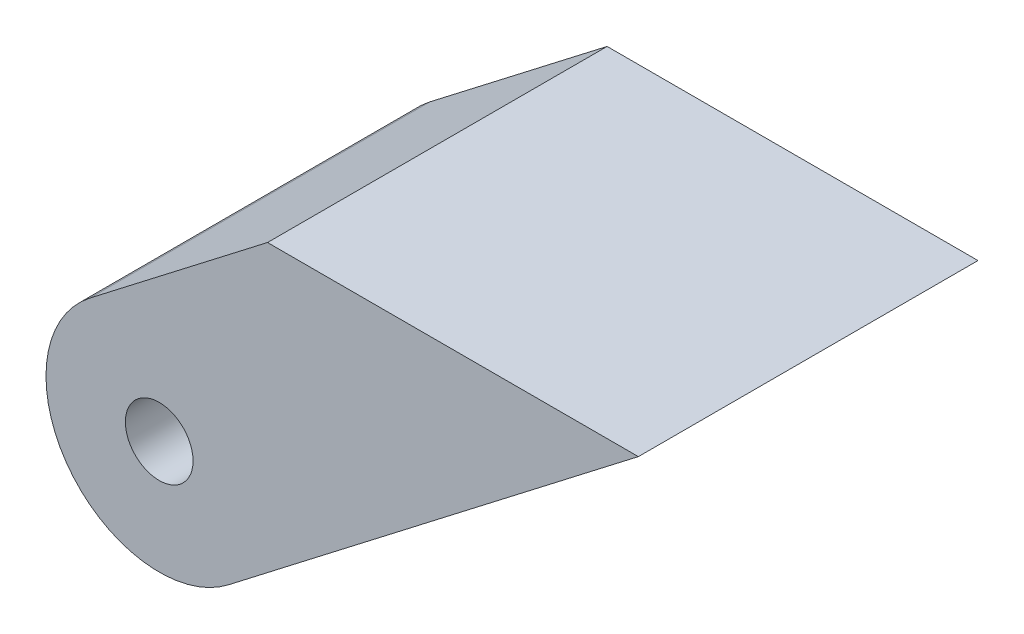
ISO-10303-21;
HEADER;
FILE_DESCRIPTION(('STEP AP214'),'2;1');
FILE_NAME('part.step','',(''),(''),'','','');
FILE_SCHEMA(('AUTOMOTIVE_DESIGN { 1 0 10303 214 1 1 1 1 }'));
ENDSEC;
DATA;
#1=APPLICATION_CONTEXT('core data for automotive mechanical design processes');
#2=APPLICATION_PROTOCOL_DEFINITION('international standard','automotive_design',2000,#1);
#3=PRODUCT_CONTEXT('',#1,'mechanical');
#4=PRODUCT('Part','Part','',(#3));
#5=PRODUCT_RELATED_PRODUCT_CATEGORY('part','',(#4));
#6=PRODUCT_DEFINITION_FORMATION('','',#4);
#7=PRODUCT_DEFINITION_CONTEXT('part definition',#1,'design');
#8=PRODUCT_DEFINITION('design','',#6,#7);
#9=PRODUCT_DEFINITION_SHAPE('','',#8);
#10=(LENGTH_UNIT() NAMED_UNIT(*) SI_UNIT(.MILLI.,.METRE.));
#11=(NAMED_UNIT(*) PLANE_ANGLE_UNIT() SI_UNIT($,.RADIAN.));
#12=(NAMED_UNIT(*) SI_UNIT($,.STERADIAN.) SOLID_ANGLE_UNIT());
#13=UNCERTAINTY_MEASURE_WITH_UNIT(LENGTH_MEASURE(1.E-05),#10,'distance_accuracy_value','');
#14=(GEOMETRIC_REPRESENTATION_CONTEXT(3) GLOBAL_UNCERTAINTY_ASSIGNED_CONTEXT((#13)) GLOBAL_UNIT_ASSIGNED_CONTEXT((#10,
#11,#12)) REPRESENTATION_CONTEXT('',''));
#15=CARTESIAN_POINT('',(0.,0.,0.));
#16=DIRECTION('',(0.,0.,1.));
#17=DIRECTION('',(1.,0.,0.));
#18=AXIS2_PLACEMENT_3D('',#15,#16,#17);
#19=CARTESIAN_POINT('',(6.074664,12.7,19.05));
#20=DIRECTION('',(0.,-1.,0.));
#21=DIRECTION('',(0.,0.,-1.));
#22=AXIS2_PLACEMENT_3D('',#19,#20,#21);
#23=PLANE('',#22);
#24=DIRECTION('',(-1.,0.,0.));
#25=VECTOR('',#24,1.);
#26=CARTESIAN_POINT('',(6.074664,12.7,0.));
#27=LINE('',#26,#25);
#28=CARTESIAN_POINT('',(26.8772330785895,12.7,0.));
#29=VERTEX_POINT('',#28);
#30=CARTESIAN_POINT('',(6.074664,12.7,0.));
#31=VERTEX_POINT('',#30);
#32=EDGE_CURVE('E98',#29,#31,#27,.T.);
#33=ORIENTED_EDGE('',*,*,#32,.T.);
#34=DIRECTION('',(0.,0.,-1.));
#35=VECTOR('',#34,1.);
#36=CARTESIAN_POINT('',(6.074664,12.7,19.05));
#37=LINE('',#36,#35);
#38=CARTESIAN_POINT('',(6.074664,12.7,19.05));
#39=VERTEX_POINT('',#38);
#40=EDGE_CURVE('E11',#39,#31,#37,.T.);
#41=ORIENTED_EDGE('',*,*,#40,.F.);
#42=DIRECTION('',(-1.,0.,0.));
#43=VECTOR('',#42,1.);
#44=CARTESIAN_POINT('',(6.074664,12.7,19.05));
#45=LINE('',#44,#43);
#46=CARTESIAN_POINT('',(26.8772330785895,12.7,19.05));
#47=VERTEX_POINT('',#46);
#48=EDGE_CURVE('E86',#47,#39,#45,.T.);
#49=ORIENTED_EDGE('',*,*,#48,.F.);
#50=DIRECTION('',(0.,0.,-1.));
#51=VECTOR('',#50,1.);
#52=CARTESIAN_POINT('',(26.8772330785895,12.7,19.05));
#53=LINE('',#52,#51);
#54=EDGE_CURVE('E94',#47,#29,#53,.T.);
#55=ORIENTED_EDGE('',*,*,#54,.T.);
#56=EDGE_LOOP('',(#33,#41,#49,#55));
#57=FACE_BOUND('',#56,.T.);
#58=ADVANCED_FACE('F35',(#57),#23,.F.);
#59=CARTESIAN_POINT('',(6.074664,12.7,19.05));
#60=DIRECTION('',(0.610501517962564,-0.792015086071854,0.));
#61=DIRECTION('',(0.792015086071854,0.610501517962564,0.));
#62=AXIS2_PLACEMENT_3D('',#59,#60,#61);
#63=PLANE('',#62);
#64=DIRECTION('',(-0.792015086071853,-0.610501517962564,0.));
#65=VECTOR('',#64,1.);
#66=CARTESIAN_POINT('',(6.074664,12.7,0.));
#67=LINE('',#66,#65);
#68=CARTESIAN_POINT('',(-3.87668463906228,5.02929579655627,0.));
#69=VERTEX_POINT('',#68);
#70=EDGE_CURVE('E90',#31,#69,#67,.T.);
#71=ORIENTED_EDGE('',*,*,#70,.T.);
#72=DIRECTION('',(0.,0.,-1.));
#73=VECTOR('',#72,1.);
#74=CARTESIAN_POINT('',(-3.87668463906228,5.02929579655627,19.05));
#75=LINE('',#74,#73);
#76=CARTESIAN_POINT('',(-3.87668463906228,5.02929579655627,19.05));
#77=VERTEX_POINT('',#76);
#78=EDGE_CURVE('E43',#77,#69,#75,.T.);
#79=ORIENTED_EDGE('',*,*,#78,.F.);
#80=DIRECTION('',(-0.792015086071853,-0.610501517962564,0.));
#81=VECTOR('',#80,1.);
#82=CARTESIAN_POINT('',(6.074664,12.7,19.05));
#83=LINE('',#82,#81);
#84=EDGE_CURVE('E81',#39,#77,#83,.T.);
#85=ORIENTED_EDGE('',*,*,#84,.F.);
#86=ORIENTED_EDGE('',*,*,#40,.T.);
#87=EDGE_LOOP('',(#71,#79,#85,#86));
#88=FACE_BOUND('',#87,.T.);
#89=ADVANCED_FACE('F89',(#88),#63,.F.);
#90=CARTESIAN_POINT('',(0.,0.,19.05));
#91=DIRECTION('',(0.,0.,-1.));
#92=DIRECTION('',(-1.,0.,0.));
#93=AXIS2_PLACEMENT_3D('',#90,#91,#92);
#94=CYLINDRICAL_SURFACE('',#93,6.35);
#95=CARTESIAN_POINT('',(0.,0.,0.));
#96=DIRECTION('',(0.,0.,1.));
#97=DIRECTION('',(1.,0.,0.));
#98=AXIS2_PLACEMENT_3D('',#95,#96,#97);
#99=CIRCLE('',#98,6.35);
#100=CARTESIAN_POINT('',(3.87668463906228,-5.02929579655627,0.));
#101=VERTEX_POINT('',#100);
#102=EDGE_CURVE('E68',#69,#101,#99,.T.);
#103=ORIENTED_EDGE('',*,*,#102,.T.);
#104=DIRECTION('',(0.,0.,-1.));
#105=VECTOR('',#104,1.);
#106=CARTESIAN_POINT('',(3.87668463906228,-5.02929579655627,19.05));
#107=LINE('',#106,#105);
#108=CARTESIAN_POINT('',(3.87668463906228,-5.02929579655627,19.05));
#109=VERTEX_POINT('',#108);
#110=EDGE_CURVE('E91',#109,#101,#107,.T.);
#111=ORIENTED_EDGE('',*,*,#110,.F.);
#112=CARTESIAN_POINT('',(0.,0.,19.05));
#113=DIRECTION('',(0.,0.,1.));
#114=DIRECTION('',(1.,0.,0.));
#115=AXIS2_PLACEMENT_3D('',#112,#113,#114);
#116=CIRCLE('',#115,6.35);
#117=EDGE_CURVE('E84',#77,#109,#116,.T.);
#118=ORIENTED_EDGE('',*,*,#117,.F.);
#119=ORIENTED_EDGE('',*,*,#78,.T.);
#120=EDGE_LOOP('',(#103,#111,#118,#119));
#121=FACE_BOUND('',#120,.T.);
#122=ADVANCED_FACE('F92',(#121),#94,.T.);
#123=CARTESIAN_POINT('',(3.87668463906228,-5.02929579655627,19.05));
#124=DIRECTION('',(-0.610501517962564,0.792015086071853,0.));
#125=DIRECTION('',(-0.792015086071853,-0.610501517962564,0.));
#126=AXIS2_PLACEMENT_3D('',#123,#124,#125);
#127=PLANE('',#126);
#128=DIRECTION('',(0.792015086071853,0.610501517962564,0.));
#129=VECTOR('',#128,1.);
#130=CARTESIAN_POINT('',(3.87668463906228,-5.02929579655627,0.));
#131=LINE('',#130,#129);
#132=EDGE_CURVE('E74',#101,#29,#131,.T.);
#133=ORIENTED_EDGE('',*,*,#132,.T.);
#134=ORIENTED_EDGE('',*,*,#54,.F.);
#135=DIRECTION('',(0.792015086071853,0.610501517962564,0.));
#136=VECTOR('',#135,1.);
#137=CARTESIAN_POINT('',(3.87668463906228,-5.02929579655627,19.05));
#138=LINE('',#137,#136);
#139=EDGE_CURVE('E51',#109,#47,#138,.T.);
#140=ORIENTED_EDGE('',*,*,#139,.F.);
#141=ORIENTED_EDGE('',*,*,#110,.T.);
#142=EDGE_LOOP('',(#133,#134,#140,#141));
#143=FACE_BOUND('',#142,.T.);
#144=ADVANCED_FACE('F106',(#143),#127,.F.);
#145=CARTESIAN_POINT('',(0.,0.,19.05));
#146=DIRECTION('',(0.,0.,1.));
#147=DIRECTION('',(1.,0.,0.));
#148=AXIS2_PLACEMENT_3D('',#145,#146,#147);
#149=PLANE('',#148);
#150=CARTESIAN_POINT('',(0.,0.,19.05));
#151=DIRECTION('',(0.,0.,1.));
#152=DIRECTION('',(1.,0.,0.));
#153=AXIS2_PLACEMENT_3D('',#150,#151,#152);
#154=CIRCLE('',#153,1.89865);
#155=CARTESIAN_POINT('',(1.89865,0.,19.05));
#156=VERTEX_POINT('',#155);
#157=EDGE_CURVE('E114',#156,#156,#154,.T.);
#158=ORIENTED_EDGE('',*,*,#157,.F.);
#159=EDGE_LOOP('',(#158));
#160=FACE_BOUND('',#159,.T.);
#161=ORIENTED_EDGE('',*,*,#48,.T.);
#162=ORIENTED_EDGE('',*,*,#84,.T.);
#163=ORIENTED_EDGE('',*,*,#117,.T.);
#164=ORIENTED_EDGE('',*,*,#139,.T.);
#165=EDGE_LOOP('',(#161,#162,#163,#164));
#166=FACE_BOUND('',#165,.T.);
#167=ADVANCED_FACE('F82',(#160,#166),#149,.T.);
#168=CARTESIAN_POINT('',(0.,0.,0.));
#169=DIRECTION('',(0.,0.,1.));
#170=DIRECTION('',(1.,0.,0.));
#171=AXIS2_PLACEMENT_3D('',#168,#169,#170);
#172=PLANE('',#171);
#173=CARTESIAN_POINT('',(0.,0.,0.));
#174=DIRECTION('',(0.,0.,1.));
#175=DIRECTION('',(1.,0.,0.));
#176=AXIS2_PLACEMENT_3D('',#173,#174,#175);
#177=CIRCLE('',#176,1.89865);
#178=CARTESIAN_POINT('',(1.89865,0.,0.));
#179=VERTEX_POINT('',#178);
#180=EDGE_CURVE('E101',#179,#179,#177,.T.);
#181=ORIENTED_EDGE('',*,*,#180,.T.);
#182=EDGE_LOOP('',(#181));
#183=FACE_BOUND('',#182,.T.);
#184=ORIENTED_EDGE('',*,*,#32,.F.);
#185=ORIENTED_EDGE('',*,*,#132,.F.);
#186=ORIENTED_EDGE('',*,*,#102,.F.);
#187=ORIENTED_EDGE('',*,*,#70,.F.);
#188=EDGE_LOOP('',(#184,#185,#186,#187));
#189=FACE_BOUND('',#188,.T.);
#190=ADVANCED_FACE('F109',(#183,#189),#172,.F.);
#191=CARTESIAN_POINT('',(0.,0.,19.05));
#192=DIRECTION('',(0.,0.,1.));
#193=DIRECTION('',(1.,0.,0.));
#194=AXIS2_PLACEMENT_3D('',#191,#192,#193);
#195=CYLINDRICAL_SURFACE('',#194,1.89865);
#196=ORIENTED_EDGE('',*,*,#180,.F.);
#197=EDGE_LOOP('',(#196));
#198=FACE_BOUND('',#197,.T.);
#199=ORIENTED_EDGE('',*,*,#157,.T.);
#200=EDGE_LOOP('',(#199));
#201=FACE_BOUND('',#200,.T.);
#202=ADVANCED_FACE('F118',(#198,#201),#195,.F.);
#203=CLOSED_SHELL('',(#58,#89,#122,#144,#167,#190,#202));
#204=MANIFOLD_SOLID_BREP('B2',#203);
#205=ADVANCED_BREP_SHAPE_REPRESENTATION('',(#18,#204),#14);
#206=SHAPE_DEFINITION_REPRESENTATION(#9,#205);
ENDSEC;
END-ISO-10303-21;
